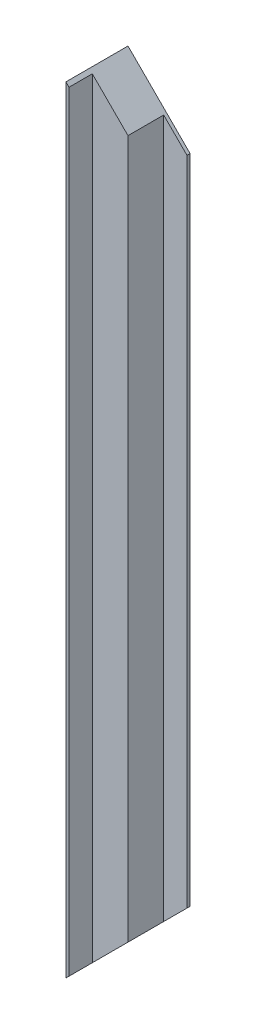
ISO-10303-21;
HEADER;
FILE_DESCRIPTION(('STEP AP214'),'2;1');
FILE_NAME('part.step','',(''),(''),'','','');
FILE_SCHEMA(('AUTOMOTIVE_DESIGN { 1 0 10303 214 1 1 1 1 }'));
ENDSEC;
DATA;
#1=APPLICATION_CONTEXT('core data for automotive mechanical design processes');
#2=APPLICATION_PROTOCOL_DEFINITION('international standard','automotive_design',2000,#1);
#3=PRODUCT_CONTEXT('',#1,'mechanical');
#4=PRODUCT('Part','Part','',(#3));
#5=PRODUCT_RELATED_PRODUCT_CATEGORY('part','',(#4));
#6=PRODUCT_DEFINITION_FORMATION('','',#4);
#7=PRODUCT_DEFINITION_CONTEXT('part definition',#1,'design');
#8=PRODUCT_DEFINITION('design','',#6,#7);
#9=PRODUCT_DEFINITION_SHAPE('','',#8);
#10=(LENGTH_UNIT() NAMED_UNIT(*) SI_UNIT(.MILLI.,.METRE.));
#11=(NAMED_UNIT(*) PLANE_ANGLE_UNIT() SI_UNIT($,.RADIAN.));
#12=(NAMED_UNIT(*) SI_UNIT($,.STERADIAN.) SOLID_ANGLE_UNIT());
#13=UNCERTAINTY_MEASURE_WITH_UNIT(LENGTH_MEASURE(1.E-05),#10,'distance_accuracy_value','');
#14=(GEOMETRIC_REPRESENTATION_CONTEXT(3) GLOBAL_UNCERTAINTY_ASSIGNED_CONTEXT((#13)) GLOBAL_UNIT_ASSIGNED_CONTEXT((#10,
#11,#12)) REPRESENTATION_CONTEXT('',''));
#15=CARTESIAN_POINT('',(0.,0.,0.));
#16=DIRECTION('',(0.,0.,1.));
#17=DIRECTION('',(1.,0.,0.));
#18=AXIS2_PLACEMENT_3D('',#15,#16,#17);
#19=CARTESIAN_POINT('',(-304.597701149425,311.781609195402,40.));
#20=DIRECTION('',(-1.,0.,0.));
#21=DIRECTION('',(0.,0.,1.));
#22=AXIS2_PLACEMENT_3D('',#19,#20,#21);
#23=PLANE('',#22);
#24=DIRECTION('',(0.,1.,0.));
#25=VECTOR('',#24,1.);
#26=CARTESIAN_POINT('',(-304.597701149425,311.781609195402,0.));
#27=LINE('',#26,#25);
#28=CARTESIAN_POINT('',(-304.597701149425,-148.218390804598,0.));
#29=VERTEX_POINT('',#28);
#30=CARTESIAN_POINT('',(-304.597701149425,271.781609195402,0.));
#31=VERTEX_POINT('',#30);
#32=EDGE_CURVE('E111',#29,#31,#27,.T.);
#33=ORIENTED_EDGE('',*,*,#32,.T.);
#34=DIRECTION('',(0.,0.,-1.));
#35=VECTOR('',#34,1.);
#36=CARTESIAN_POINT('',(-304.597701149425,271.781609195402,1000.));
#37=LINE('',#36,#35);
#38=CARTESIAN_POINT('',(-304.597701149425,271.781609195402,2.));
#39=VERTEX_POINT('',#38);
#40=EDGE_CURVE('E94',#39,#31,#37,.T.);
#41=ORIENTED_EDGE('',*,*,#40,.F.);
#42=DIRECTION('',(0.,1.,0.));
#43=VECTOR('',#42,1.);
#44=CARTESIAN_POINT('',(-304.597701149425,-688.218390804598,2.));
#45=LINE('',#44,#43);
#46=CARTESIAN_POINT('',(-304.597701149425,-148.218390804598,2.));
#47=VERTEX_POINT('',#46);
#48=EDGE_CURVE('E122',#47,#39,#45,.T.);
#49=ORIENTED_EDGE('',*,*,#48,.F.);
#50=DIRECTION('',(0.,0.,-1.));
#51=VECTOR('',#50,1.);
#52=CARTESIAN_POINT('',(-304.597701149425,-148.218390804598,1000.));
#53=LINE('',#52,#51);
#54=EDGE_CURVE('E114',#47,#29,#53,.T.);
#55=ORIENTED_EDGE('',*,*,#54,.T.);
#56=EDGE_LOOP('',(#33,#41,#49,#55));
#57=FACE_BOUND('',#56,.T.);
#58=ADVANCED_FACE('F32',(#57),#23,.F.);
#59=CARTESIAN_POINT('',(-344.597701149425,311.781609195402,40.));
#60=DIRECTION('',(1.,0.,0.));
#61=DIRECTION('',(0.,1.,0.));
#62=AXIS2_PLACEMENT_3D('',#59,#60,#61);
#63=PLANE('',#62);
#64=DIRECTION('',(0.,-1.,0.));
#65=VECTOR('',#64,1.);
#66=CARTESIAN_POINT('',(-344.597701149425,311.781609195402,0.));
#67=LINE('',#66,#65);
#68=CARTESIAN_POINT('',(-344.597701149425,311.781609195402,0.));
#69=VERTEX_POINT('',#68);
#70=CARTESIAN_POINT('',(-344.597701149425,-188.218390804598,0.));
#71=VERTEX_POINT('',#70);
#72=EDGE_CURVE('E113',#69,#71,#67,.T.);
#73=ORIENTED_EDGE('',*,*,#72,.T.);
#74=DIRECTION('',(0.,0.,-1.));
#75=VECTOR('',#74,1.);
#76=CARTESIAN_POINT('',(-344.597701149425,-188.218390804598,40.));
#77=LINE('',#76,#75);
#78=CARTESIAN_POINT('',(-344.597701149425,-188.218390804598,40.));
#79=VERTEX_POINT('',#78);
#80=EDGE_CURVE('E126',#79,#71,#77,.T.);
#81=ORIENTED_EDGE('',*,*,#80,.F.);
#82=DIRECTION('',(0.,-1.,0.));
#83=VECTOR('',#82,1.);
#84=CARTESIAN_POINT('',(-344.597701149425,311.781609195402,40.));
#85=LINE('',#84,#83);
#86=CARTESIAN_POINT('',(-344.597701149425,311.781609195402,40.));
#87=VERTEX_POINT('',#86);
#88=EDGE_CURVE('E117',#87,#79,#85,.T.);
#89=ORIENTED_EDGE('',*,*,#88,.F.);
#90=DIRECTION('',(0.,0.,-1.));
#91=VECTOR('',#90,1.);
#92=CARTESIAN_POINT('',(-344.597701149425,311.781609195402,40.));
#93=LINE('',#92,#91);
#94=EDGE_CURVE('E120',#87,#69,#93,.T.);
#95=ORIENTED_EDGE('',*,*,#94,.T.);
#96=EDGE_LOOP('',(#73,#81,#89,#95));
#97=FACE_BOUND('',#96,.T.);
#98=ADVANCED_FACE('F34',(#97),#63,.F.);
#99=CARTESIAN_POINT('',(0.,0.,40.));
#100=DIRECTION('',(0.,0.,1.));
#101=DIRECTION('',(1.,0.,0.));
#102=AXIS2_PLACEMENT_3D('',#99,#100,#101);
#103=PLANE('',#102);
#104=DIRECTION('',(0.707106781186548,-0.707106781186548,0.));
#105=VECTOR('',#104,1.);
#106=CARTESIAN_POINT('',(-16.4080459770112,-16.4080459770112,40.));
#107=LINE('',#106,#105);
#108=CARTESIAN_POINT('',(-342.597701149425,309.781609195402,40.));
#109=VERTEX_POINT('',#108);
#110=EDGE_CURVE('E47',#87,#109,#107,.T.);
#111=ORIENTED_EDGE('',*,*,#110,.F.);
#112=ORIENTED_EDGE('',*,*,#88,.T.);
#113=DIRECTION('',(-0.707106781186547,-0.707106781186548,0.));
#114=VECTOR('',#113,1.);
#115=CARTESIAN_POINT('',(-78.1896551724139,78.1896551724138,40.));
#116=LINE('',#115,#114);
#117=CARTESIAN_POINT('',(-342.597701149425,-186.218390804598,40.));
#118=VERTEX_POINT('',#117);
#119=EDGE_CURVE('E164',#118,#79,#116,.T.);
#120=ORIENTED_EDGE('',*,*,#119,.F.);
#121=DIRECTION('',(0.,-1.,0.));
#122=VECTOR('',#121,1.);
#123=CARTESIAN_POINT('',(-342.597701149425,0.,40.));
#124=LINE('',#123,#122);
#125=EDGE_CURVE('E128',#109,#118,#124,.T.);
#126=ORIENTED_EDGE('',*,*,#125,.F.);
#127=EDGE_LOOP('',(#111,#112,#120,#126));
#128=FACE_BOUND('',#127,.T.);
#129=ADVANCED_FACE('F175',(#128),#103,.T.);
#130=CARTESIAN_POINT('',(0.,0.,0.));
#131=DIRECTION('',(0.,0.,1.));
#132=DIRECTION('',(1.,0.,0.));
#133=AXIS2_PLACEMENT_3D('',#130,#131,#132);
#134=PLANE('',#133);
#135=ORIENTED_EDGE('',*,*,#72,.F.);
#136=DIRECTION('',(-0.707106781186547,0.707106781186547,0.));
#137=VECTOR('',#136,1.);
#138=CARTESIAN_POINT('',(-344.597701149425,311.781609195402,0.));
#139=LINE('',#138,#137);
#140=EDGE_CURVE('E97',#31,#69,#139,.T.);
#141=ORIENTED_EDGE('',*,*,#140,.F.);
#142=ORIENTED_EDGE('',*,*,#32,.F.);
#143=DIRECTION('',(0.707106781186547,0.707106781186548,0.));
#144=VECTOR('',#143,1.);
#145=CARTESIAN_POINT('',(-304.597701149425,-148.218390804598,0.));
#146=LINE('',#145,#144);
#147=EDGE_CURVE('E168',#71,#29,#146,.T.);
#148=ORIENTED_EDGE('',*,*,#147,.F.);
#149=EDGE_LOOP('',(#135,#141,#142,#148));
#150=FACE_BOUND('',#149,.T.);
#151=ADVANCED_FACE('F109',(#150),#134,.F.);
#152=CARTESIAN_POINT('',(0.,-688.218390804598,2.));
#153=DIRECTION('',(0.,0.,1.));
#154=DIRECTION('',(1.,0.,0.));
#155=AXIS2_PLACEMENT_3D('',#152,#153,#154);
#156=PLANE('',#155);
#157=DIRECTION('',(0.707106781186548,-0.707106781186548,0.));
#158=VECTOR('',#157,1.);
#159=CARTESIAN_POINT('',(327.701149425288,-360.51724137931,2.));
#160=LINE('',#159,#158);
#161=CARTESIAN_POINT('',(-319.597701149425,286.781609195402,2.));
#162=VERTEX_POINT('',#161);
#163=EDGE_CURVE('E100',#162,#39,#160,.T.);
#164=ORIENTED_EDGE('',*,*,#163,.F.);
#165=DIRECTION('',(0.,1.,0.));
#166=VECTOR('',#165,1.);
#167=CARTESIAN_POINT('',(-319.597701149425,-688.218390804598,2.));
#168=LINE('',#167,#166);
#169=CARTESIAN_POINT('',(-319.597701149425,-163.218390804598,2.));
#170=VERTEX_POINT('',#169);
#171=EDGE_CURVE('E146',#170,#162,#168,.T.);
#172=ORIENTED_EDGE('',*,*,#171,.F.);
#173=DIRECTION('',(-0.707106781186547,-0.707106781186548,0.));
#174=VECTOR('',#173,1.);
#175=CARTESIAN_POINT('',(-422.298850574713,-265.919540229885,2.));
#176=LINE('',#175,#174);
#177=EDGE_CURVE('E160',#47,#170,#176,.T.);
#178=ORIENTED_EDGE('',*,*,#177,.F.);
#179=ORIENTED_EDGE('',*,*,#48,.T.);
#180=EDGE_LOOP('',(#164,#172,#178,#179));
#181=FACE_BOUND('',#180,.T.);
#182=ADVANCED_FACE('F182',(#181),#156,.T.);
#183=CARTESIAN_POINT('',(0.,-688.218390804598,25.));
#184=DIRECTION('',(0.,0.,1.));
#185=DIRECTION('',(1.,0.,0.));
#186=AXIS2_PLACEMENT_3D('',#183,#184,#185);
#187=PLANE('',#186);
#188=DIRECTION('',(0.707106781186548,-0.707106781186548,0.));
#189=VECTOR('',#188,1.);
#190=CARTESIAN_POINT('',(327.701149425288,-360.51724137931,25.));
#191=LINE('',#190,#189);
#192=CARTESIAN_POINT('',(-342.597701149425,309.781609195402,25.));
#193=VERTEX_POINT('',#192);
#194=CARTESIAN_POINT('',(-319.597701149425,286.781609195402,25.));
#195=VERTEX_POINT('',#194);
#196=EDGE_CURVE('E142',#193,#195,#191,.T.);
#197=ORIENTED_EDGE('',*,*,#196,.F.);
#198=DIRECTION('',(0.,1.,0.));
#199=VECTOR('',#198,1.);
#200=CARTESIAN_POINT('',(-342.597701149425,-688.218390804598,25.));
#201=LINE('',#200,#199);
#202=CARTESIAN_POINT('',(-342.597701149425,-186.218390804598,25.));
#203=VERTEX_POINT('',#202);
#204=EDGE_CURVE('E134',#203,#193,#201,.T.);
#205=ORIENTED_EDGE('',*,*,#204,.F.);
#206=DIRECTION('',(-0.707106781186547,-0.707106781186548,0.));
#207=VECTOR('',#206,1.);
#208=CARTESIAN_POINT('',(-422.298850574713,-265.919540229885,25.));
#209=LINE('',#208,#207);
#210=CARTESIAN_POINT('',(-319.597701149425,-163.218390804598,25.));
#211=VERTEX_POINT('',#210);
#212=EDGE_CURVE('E54',#211,#203,#209,.T.);
#213=ORIENTED_EDGE('',*,*,#212,.F.);
#214=DIRECTION('',(0.,1.,0.));
#215=VECTOR('',#214,1.);
#216=CARTESIAN_POINT('',(-319.597701149425,-688.218390804598,25.));
#217=LINE('',#216,#215);
#218=EDGE_CURVE('E143',#211,#195,#217,.T.);
#219=ORIENTED_EDGE('',*,*,#218,.T.);
#220=EDGE_LOOP('',(#197,#205,#213,#219));
#221=FACE_BOUND('',#220,.T.);
#222=ADVANCED_FACE('F139',(#221),#187,.T.);
#223=CARTESIAN_POINT('',(-319.597701149425,-688.218390804598,0.));
#224=DIRECTION('',(-1.,0.,0.));
#225=DIRECTION('',(0.,0.,1.));
#226=AXIS2_PLACEMENT_3D('',#223,#224,#225);
#227=PLANE('',#226);
#228=ORIENTED_EDGE('',*,*,#171,.T.);
#229=DIRECTION('',(0.,0.,1.));
#230=VECTOR('',#229,1.);
#231=CARTESIAN_POINT('',(-319.597701149425,286.781609195402,0.));
#232=LINE('',#231,#230);
#233=EDGE_CURVE('E155',#162,#195,#232,.T.);
#234=ORIENTED_EDGE('',*,*,#233,.T.);
#235=ORIENTED_EDGE('',*,*,#218,.F.);
#236=DIRECTION('',(0.,0.,-1.));
#237=VECTOR('',#236,1.);
#238=CARTESIAN_POINT('',(-319.597701149425,-163.218390804598,0.));
#239=LINE('',#238,#237);
#240=EDGE_CURVE('E162',#211,#170,#239,.T.);
#241=ORIENTED_EDGE('',*,*,#240,.T.);
#242=EDGE_LOOP('',(#228,#234,#235,#241));
#243=FACE_BOUND('',#242,.T.);
#244=ADVANCED_FACE('F219',(#243),#227,.F.);
#245=CARTESIAN_POINT('',(-342.597701149425,-688.218390804598,0.));
#246=DIRECTION('',(-1.,0.,0.));
#247=DIRECTION('',(0.,0.,1.));
#248=AXIS2_PLACEMENT_3D('',#245,#246,#247);
#249=PLANE('',#248);
#250=ORIENTED_EDGE('',*,*,#204,.T.);
#251=DIRECTION('',(0.,0.,1.));
#252=VECTOR('',#251,1.);
#253=CARTESIAN_POINT('',(-342.597701149425,309.781609195402,0.));
#254=LINE('',#253,#252);
#255=EDGE_CURVE('E11',#193,#109,#254,.T.);
#256=ORIENTED_EDGE('',*,*,#255,.T.);
#257=ORIENTED_EDGE('',*,*,#125,.T.);
#258=DIRECTION('',(0.,0.,-1.));
#259=VECTOR('',#258,1.);
#260=CARTESIAN_POINT('',(-342.597701149425,-186.218390804598,0.));
#261=LINE('',#260,#259);
#262=EDGE_CURVE('E40',#118,#203,#261,.T.);
#263=ORIENTED_EDGE('',*,*,#262,.T.);
#264=EDGE_LOOP('',(#250,#256,#257,#263));
#265=FACE_BOUND('',#264,.T.);
#266=ADVANCED_FACE('F133',(#265),#249,.F.);
#267=CARTESIAN_POINT('',(-304.597701149425,-148.218390804598,1000.));
#268=DIRECTION('',(-0.707106781186548,0.707106781186547,0.));
#269=DIRECTION('',(-0.707106781186547,-0.707106781186548,0.));
#270=AXIS2_PLACEMENT_3D('',#267,#268,#269);
#271=PLANE('',#270);
#272=ORIENTED_EDGE('',*,*,#177,.T.);
#273=ORIENTED_EDGE('',*,*,#240,.F.);
#274=ORIENTED_EDGE('',*,*,#212,.T.);
#275=ORIENTED_EDGE('',*,*,#262,.F.);
#276=ORIENTED_EDGE('',*,*,#119,.T.);
#277=ORIENTED_EDGE('',*,*,#80,.T.);
#278=ORIENTED_EDGE('',*,*,#147,.T.);
#279=ORIENTED_EDGE('',*,*,#54,.F.);
#280=EDGE_LOOP('',(#272,#273,#274,#275,#276,#277,#278,#279));
#281=FACE_BOUND('',#280,.T.);
#282=ADVANCED_FACE('F169',(#281),#271,.F.);
#283=CARTESIAN_POINT('',(-344.597701149425,311.781609195402,1000.));
#284=DIRECTION('',(-0.707106781186548,-0.707106781186548,0.));
#285=DIRECTION('',(0.707106781186548,-0.707106781186548,0.));
#286=AXIS2_PLACEMENT_3D('',#283,#284,#285);
#287=PLANE('',#286);
#288=ORIENTED_EDGE('',*,*,#163,.T.);
#289=ORIENTED_EDGE('',*,*,#40,.T.);
#290=ORIENTED_EDGE('',*,*,#140,.T.);
#291=ORIENTED_EDGE('',*,*,#94,.F.);
#292=ORIENTED_EDGE('',*,*,#110,.T.);
#293=ORIENTED_EDGE('',*,*,#255,.F.);
#294=ORIENTED_EDGE('',*,*,#196,.T.);
#295=ORIENTED_EDGE('',*,*,#233,.F.);
#296=EDGE_LOOP('',(#288,#289,#290,#291,#292,#293,#294,#295));
#297=FACE_BOUND('',#296,.T.);
#298=ADVANCED_FACE('F96',(#297),#287,.F.);
#299=CLOSED_SHELL('',(#58,#98,#129,#151,#182,#222,#244,#266,#282,#298));
#300=MANIFOLD_SOLID_BREP('B2',#299);
#301=ADVANCED_BREP_SHAPE_REPRESENTATION('',(#18,#300),#14);
#302=SHAPE_DEFINITION_REPRESENTATION(#9,#301);
ENDSEC;
END-ISO-10303-21;
